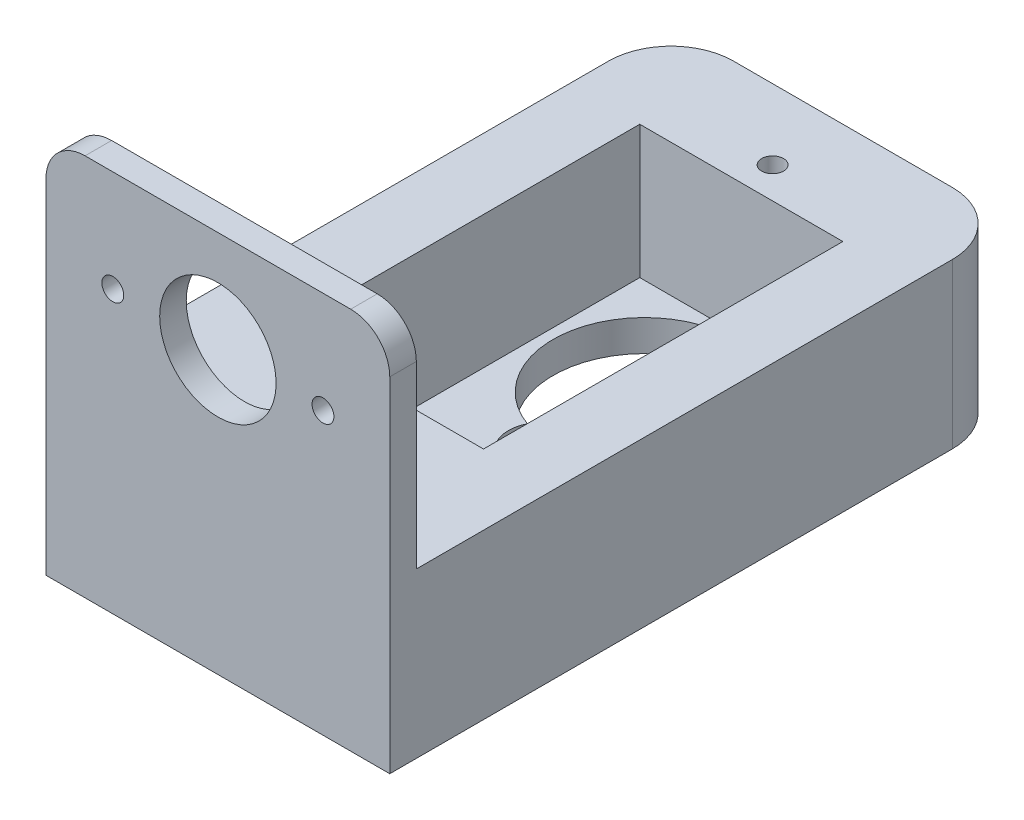
ISO-10303-21;
HEADER;
FILE_DESCRIPTION(('STEP AP214'),'2;1');
FILE_NAME('part.step','',(''),(''),'','','');
FILE_SCHEMA(('AUTOMOTIVE_DESIGN { 1 0 10303 214 1 1 1 1 }'));
ENDSEC;
DATA;
#1=APPLICATION_CONTEXT('core data for automotive mechanical design processes');
#2=APPLICATION_PROTOCOL_DEFINITION('international standard','automotive_design',2000,#1);
#3=PRODUCT_CONTEXT('',#1,'mechanical');
#4=PRODUCT('Part','Part','',(#3));
#5=PRODUCT_RELATED_PRODUCT_CATEGORY('part','',(#4));
#6=PRODUCT_DEFINITION_FORMATION('','',#4);
#7=PRODUCT_DEFINITION_CONTEXT('part definition',#1,'design');
#8=PRODUCT_DEFINITION('design','',#6,#7);
#9=PRODUCT_DEFINITION_SHAPE('','',#8);
#10=(LENGTH_UNIT() NAMED_UNIT(*) SI_UNIT(.MILLI.,.METRE.));
#11=(NAMED_UNIT(*) PLANE_ANGLE_UNIT() SI_UNIT($,.RADIAN.));
#12=(NAMED_UNIT(*) SI_UNIT($,.STERADIAN.) SOLID_ANGLE_UNIT());
#13=UNCERTAINTY_MEASURE_WITH_UNIT(LENGTH_MEASURE(1.E-05),#10,'distance_accuracy_value','');
#14=(GEOMETRIC_REPRESENTATION_CONTEXT(3) GLOBAL_UNCERTAINTY_ASSIGNED_CONTEXT((#13)) GLOBAL_UNIT_ASSIGNED_CONTEXT((#10,
#11,#12)) REPRESENTATION_CONTEXT('',''));
#15=CARTESIAN_POINT('',(0.,0.,0.));
#16=DIRECTION('',(0.,0.,1.));
#17=DIRECTION('',(1.,0.,0.));
#18=AXIS2_PLACEMENT_3D('',#15,#16,#17);
#19=CARTESIAN_POINT('',(0.,10.5,0.));
#20=DIRECTION('',(0.,0.,-1.));
#21=DIRECTION('',(-1.,0.,0.));
#22=AXIS2_PLACEMENT_3D('',#19,#20,#21);
#23=PLANE('',#22);
#24=CARTESIAN_POINT('',(4.275,18.,0.));
#25=DIRECTION('',(0.,0.,-1.));
#26=DIRECTION('',(-1.,0.,0.));
#27=AXIS2_PLACEMENT_3D('',#24,#25,#26);
#28=CIRCLE('',#27,0.7);
#29=CARTESIAN_POINT('',(3.575,18.,0.));
#30=VERTEX_POINT('',#29);
#31=EDGE_CURVE('E292',#30,#30,#28,.T.);
#32=ORIENTED_EDGE('',*,*,#31,.T.);
#33=EDGE_LOOP('',(#32));
#34=FACE_BOUND('',#33,.T.);
#35=CARTESIAN_POINT('',(17.725,18.,0.));
#36=DIRECTION('',(0.,0.,-1.));
#37=DIRECTION('',(-1.,0.,0.));
#38=AXIS2_PLACEMENT_3D('',#35,#36,#37);
#39=CIRCLE('',#38,0.699999999999998);
#40=CARTESIAN_POINT('',(17.025,18.,0.));
#41=VERTEX_POINT('',#40);
#42=EDGE_CURVE('E296',#41,#41,#39,.T.);
#43=ORIENTED_EDGE('',*,*,#42,.T.);
#44=EDGE_LOOP('',(#43));
#45=FACE_BOUND('',#44,.T.);
#46=CARTESIAN_POINT('',(11.,18.,0.));
#47=DIRECTION('',(0.,0.,-1.));
#48=DIRECTION('',(-1.,0.,0.));
#49=AXIS2_PLACEMENT_3D('',#46,#47,#48);
#50=CIRCLE('',#49,3.725);
#51=CARTESIAN_POINT('',(7.275,18.,0.));
#52=VERTEX_POINT('',#51);
#53=EDGE_CURVE('E284',#52,#52,#50,.T.);
#54=ORIENTED_EDGE('',*,*,#53,.T.);
#55=EDGE_LOOP('',(#54));
#56=FACE_BOUND('',#55,.T.);
#57=DIRECTION('',(1.,0.,0.));
#58=VECTOR('',#57,1.);
#59=CARTESIAN_POINT('',(0.,24.5,0.));
#60=LINE('',#59,#58);
#61=CARTESIAN_POINT('',(2.5,24.5,0.));
#62=VERTEX_POINT('',#61);
#63=CARTESIAN_POINT('',(19.5,24.5,0.));
#64=VERTEX_POINT('',#63);
#65=EDGE_CURVE('E273',#62,#64,#60,.T.);
#66=ORIENTED_EDGE('',*,*,#65,.F.);
#67=CARTESIAN_POINT('',(2.5,22.,0.));
#68=DIRECTION('',(0.,0.,-1.));
#69=DIRECTION('',(-1.,0.,0.));
#70=AXIS2_PLACEMENT_3D('',#67,#68,#69);
#71=CIRCLE('',#70,2.5);
#72=CARTESIAN_POINT('',(0.,22.,0.));
#73=VERTEX_POINT('',#72);
#74=EDGE_CURVE('E248',#62,#73,#71,.F.);
#75=ORIENTED_EDGE('',*,*,#74,.T.);
#76=DIRECTION('',(0.,-1.,0.));
#77=VECTOR('',#76,1.);
#78=CARTESIAN_POINT('',(0.,10.5,0.));
#79=LINE('',#78,#77);
#80=CARTESIAN_POINT('',(0.,0.,0.));
#81=VERTEX_POINT('',#80);
#82=EDGE_CURVE('E208',#73,#81,#79,.T.);
#83=ORIENTED_EDGE('',*,*,#82,.T.);
#84=DIRECTION('',(1.,0.,0.));
#85=VECTOR('',#84,1.);
#86=CARTESIAN_POINT('',(0.,0.,0.));
#87=LINE('',#86,#85);
#88=CARTESIAN_POINT('',(22.,0.,0.));
#89=VERTEX_POINT('',#88);
#90=EDGE_CURVE('E191',#81,#89,#87,.T.);
#91=ORIENTED_EDGE('',*,*,#90,.T.);
#92=DIRECTION('',(0.,-1.,0.));
#93=VECTOR('',#92,1.);
#94=CARTESIAN_POINT('',(22.,10.5,0.));
#95=LINE('',#94,#93);
#96=CARTESIAN_POINT('',(22.,22.,0.));
#97=VERTEX_POINT('',#96);
#98=EDGE_CURVE('E220',#97,#89,#95,.T.);
#99=ORIENTED_EDGE('',*,*,#98,.F.);
#100=CARTESIAN_POINT('',(19.5,22.,0.));
#101=DIRECTION('',(0.,0.,-1.));
#102=DIRECTION('',(-1.,0.,0.));
#103=AXIS2_PLACEMENT_3D('',#100,#101,#102);
#104=CIRCLE('',#103,2.5);
#105=EDGE_CURVE('E246',#97,#64,#104,.F.);
#106=ORIENTED_EDGE('',*,*,#105,.T.);
#107=EDGE_LOOP('',(#66,#75,#83,#91,#99,#106));
#108=FACE_BOUND('',#107,.T.);
#109=ADVANCED_FACE('F33',(#34,#45,#56,#108),#23,.F.);
#110=CARTESIAN_POINT('',(22.,10.5,0.));
#111=DIRECTION('',(-1.,0.,0.));
#112=DIRECTION('',(0.,0.,1.));
#113=AXIS2_PLACEMENT_3D('',#110,#111,#112);
#114=PLANE('',#113);
#115=DIRECTION('',(0.,-1.,0.));
#116=VECTOR('',#115,1.);
#117=CARTESIAN_POINT('',(22.,24.5,-1.7));
#118=LINE('',#117,#116);
#119=CARTESIAN_POINT('',(22.,22.,-1.7));
#120=VERTEX_POINT('',#119);
#121=CARTESIAN_POINT('',(22.,10.5,-1.7));
#122=VERTEX_POINT('',#121);
#123=EDGE_CURVE('E159',#120,#122,#118,.T.);
#124=ORIENTED_EDGE('',*,*,#123,.F.);
#125=DIRECTION('',(0.,0.,-1.));
#126=VECTOR('',#125,1.);
#127=CARTESIAN_POINT('',(22.,22.,0.));
#128=LINE('',#127,#126);
#129=EDGE_CURVE('E150',#120,#97,#128,.F.);
#130=ORIENTED_EDGE('',*,*,#129,.T.);
#131=ORIENTED_EDGE('',*,*,#98,.T.);
#132=DIRECTION('',(0.,0.,-1.));
#133=VECTOR('',#132,1.);
#134=CARTESIAN_POINT('',(22.,0.,0.));
#135=LINE('',#134,#133);
#136=CARTESIAN_POINT('',(22.,0.,-36.));
#137=VERTEX_POINT('',#136);
#138=EDGE_CURVE('E211',#89,#137,#135,.T.);
#139=ORIENTED_EDGE('',*,*,#138,.T.);
#140=DIRECTION('',(0.,-1.,0.));
#141=VECTOR('',#140,1.);
#142=CARTESIAN_POINT('',(22.,10.5,-36.));
#143=LINE('',#142,#141);
#144=CARTESIAN_POINT('',(22.,10.5,-36.));
#145=VERTEX_POINT('',#144);
#146=EDGE_CURVE('E238',#137,#145,#143,.F.);
#147=ORIENTED_EDGE('',*,*,#146,.T.);
#148=DIRECTION('',(0.,0.,-1.));
#149=VECTOR('',#148,1.);
#150=CARTESIAN_POINT('',(22.,10.5,0.));
#151=LINE('',#150,#149);
#152=EDGE_CURVE('E198',#122,#145,#151,.T.);
#153=ORIENTED_EDGE('',*,*,#152,.F.);
#154=EDGE_LOOP('',(#124,#130,#131,#139,#147,#153));
#155=FACE_BOUND('',#154,.T.);
#156=ADVANCED_FACE('F258',(#155),#114,.F.);
#157=CARTESIAN_POINT('',(0.,10.5,-40.));
#158=DIRECTION('',(0.,0.,-1.));
#159=DIRECTION('',(-1.,0.,0.));
#160=AXIS2_PLACEMENT_3D('',#157,#158,#159);
#161=PLANE('',#160);
#162=DIRECTION('',(1.,0.,0.));
#163=VECTOR('',#162,1.);
#164=CARTESIAN_POINT('',(0.,0.,-40.));
#165=LINE('',#164,#163);
#166=CARTESIAN_POINT('',(3.99999999999999,0.,-40.));
#167=VERTEX_POINT('',#166);
#168=CARTESIAN_POINT('',(18.,0.,-40.));
#169=VERTEX_POINT('',#168);
#170=EDGE_CURVE('E214',#167,#169,#165,.T.);
#171=ORIENTED_EDGE('',*,*,#170,.F.);
#172=DIRECTION('',(0.,-1.,0.));
#173=VECTOR('',#172,1.);
#174=CARTESIAN_POINT('',(3.99999999999999,10.5,-40.));
#175=LINE('',#174,#173);
#176=CARTESIAN_POINT('',(3.99999999999999,10.5,-40.));
#177=VERTEX_POINT('',#176);
#178=EDGE_CURVE('E232',#167,#177,#175,.F.);
#179=ORIENTED_EDGE('',*,*,#178,.T.);
#180=DIRECTION('',(1.,0.,0.));
#181=VECTOR('',#180,1.);
#182=CARTESIAN_POINT('',(0.,10.5,-40.));
#183=LINE('',#182,#181);
#184=CARTESIAN_POINT('',(18.,10.5,-40.));
#185=VERTEX_POINT('',#184);
#186=EDGE_CURVE('E201',#177,#185,#183,.T.);
#187=ORIENTED_EDGE('',*,*,#186,.T.);
#188=DIRECTION('',(0.,-1.,0.));
#189=VECTOR('',#188,1.);
#190=CARTESIAN_POINT('',(18.,0.,-40.));
#191=LINE('',#190,#189);
#192=EDGE_CURVE('E229',#185,#169,#191,.T.);
#193=ORIENTED_EDGE('',*,*,#192,.T.);
#194=EDGE_LOOP('',(#171,#179,#187,#193));
#195=FACE_BOUND('',#194,.T.);
#196=ADVANCED_FACE('F338',(#195),#161,.T.);
#197=CARTESIAN_POINT('',(0.,10.5,0.));
#198=DIRECTION('',(-1.,0.,0.));
#199=DIRECTION('',(0.,0.,1.));
#200=AXIS2_PLACEMENT_3D('',#197,#198,#199);
#201=PLANE('',#200);
#202=ORIENTED_EDGE('',*,*,#82,.F.);
#203=DIRECTION('',(0.,0.,1.));
#204=VECTOR('',#203,1.);
#205=CARTESIAN_POINT('',(0.,22.,0.));
#206=LINE('',#205,#204);
#207=CARTESIAN_POINT('',(0.,22.,-1.7));
#208=VERTEX_POINT('',#207);
#209=EDGE_CURVE('E250',#73,#208,#206,.F.);
#210=ORIENTED_EDGE('',*,*,#209,.T.);
#211=DIRECTION('',(0.,-1.,0.));
#212=VECTOR('',#211,1.);
#213=CARTESIAN_POINT('',(0.,24.5,-1.7));
#214=LINE('',#213,#212);
#215=CARTESIAN_POINT('',(0.,10.5,-1.7));
#216=VERTEX_POINT('',#215);
#217=EDGE_CURVE('E163',#208,#216,#214,.T.);
#218=ORIENTED_EDGE('',*,*,#217,.T.);
#219=DIRECTION('',(0.,0.,-1.));
#220=VECTOR('',#219,1.);
#221=CARTESIAN_POINT('',(0.,10.5,0.));
#222=LINE('',#221,#220);
#223=CARTESIAN_POINT('',(0.,10.5,-36.));
#224=VERTEX_POINT('',#223);
#225=EDGE_CURVE('E205',#216,#224,#222,.T.);
#226=ORIENTED_EDGE('',*,*,#225,.T.);
#227=DIRECTION('',(0.,-1.,0.));
#228=VECTOR('',#227,1.);
#229=CARTESIAN_POINT('',(0.,10.5,-36.));
#230=LINE('',#229,#228);
#231=CARTESIAN_POINT('',(0.,0.,-36.));
#232=VERTEX_POINT('',#231);
#233=EDGE_CURVE('E222',#224,#232,#230,.T.);
#234=ORIENTED_EDGE('',*,*,#233,.T.);
#235=DIRECTION('',(0.,0.,-1.));
#236=VECTOR('',#235,1.);
#237=CARTESIAN_POINT('',(0.,0.,0.));
#238=LINE('',#237,#236);
#239=EDGE_CURVE('E202',#81,#232,#238,.T.);
#240=ORIENTED_EDGE('',*,*,#239,.F.);
#241=EDGE_LOOP('',(#202,#210,#218,#226,#234,#240));
#242=FACE_BOUND('',#241,.T.);
#243=ADVANCED_FACE('F328',(#242),#201,.T.);
#244=CARTESIAN_POINT('',(0.,10.5,0.));
#245=DIRECTION('',(0.,1.,0.));
#246=DIRECTION('',(0.,0.,1.));
#247=AXIS2_PLACEMENT_3D('',#244,#245,#246);
#248=PLANE('',#247);
#249=CARTESIAN_POINT('',(11.,10.5,-35.5));
#250=DIRECTION('',(0.,1.,0.));
#251=DIRECTION('',(0.,0.,1.));
#252=AXIS2_PLACEMENT_3D('',#249,#250,#251);
#253=CIRCLE('',#252,0.699999999999999);
#254=CARTESIAN_POINT('',(11.,10.5,-34.8));
#255=VERTEX_POINT('',#254);
#256=EDGE_CURVE('E312',#255,#255,#253,.T.);
#257=ORIENTED_EDGE('',*,*,#256,.F.);
#258=EDGE_LOOP('',(#257));
#259=FACE_BOUND('',#258,.T.);
#260=CARTESIAN_POINT('',(11.,10.5,-7.5));
#261=DIRECTION('',(0.,1.,0.));
#262=DIRECTION('',(0.,0.,1.));
#263=AXIS2_PLACEMENT_3D('',#260,#261,#262);
#264=CIRCLE('',#263,0.7);
#265=CARTESIAN_POINT('',(11.,10.5,-6.8));
#266=VERTEX_POINT('',#265);
#267=EDGE_CURVE('E306',#266,#266,#264,.T.);
#268=ORIENTED_EDGE('',*,*,#267,.F.);
#269=EDGE_LOOP('',(#268));
#270=FACE_BOUND('',#269,.T.);
#271=ORIENTED_EDGE('',*,*,#186,.F.);
#272=CARTESIAN_POINT('',(3.99999999999999,10.5,-36.));
#273=DIRECTION('',(0.,1.,0.));
#274=DIRECTION('',(0.,0.,1.));
#275=AXIS2_PLACEMENT_3D('',#272,#273,#274);
#276=CIRCLE('',#275,4.);
#277=EDGE_CURVE('E236',#177,#224,#276,.T.);
#278=ORIENTED_EDGE('',*,*,#277,.T.);
#279=ORIENTED_EDGE('',*,*,#225,.F.);
#280=DIRECTION('',(-1.,0.,0.));
#281=VECTOR('',#280,1.);
#282=CARTESIAN_POINT('',(0.,10.5,-1.7));
#283=LINE('',#282,#281);
#284=EDGE_CURVE('E279',#122,#216,#283,.T.);
#285=ORIENTED_EDGE('',*,*,#284,.F.);
#286=ORIENTED_EDGE('',*,*,#152,.T.);
#287=CARTESIAN_POINT('',(18.,10.5,-36.));
#288=DIRECTION('',(0.,1.,0.));
#289=DIRECTION('',(0.,0.,1.));
#290=AXIS2_PLACEMENT_3D('',#287,#288,#289);
#291=CIRCLE('',#290,4.);
#292=EDGE_CURVE('E234',#145,#185,#291,.T.);
#293=ORIENTED_EDGE('',*,*,#292,.T.);
#294=EDGE_LOOP('',(#271,#278,#279,#285,#286,#293));
#295=FACE_BOUND('',#294,.T.);
#296=DIRECTION('',(0.,0.,1.));
#297=VECTOR('',#296,1.);
#298=CARTESIAN_POINT('',(4.5,10.5,-33.5));
#299=LINE('',#298,#297);
#300=CARTESIAN_POINT('',(4.5,10.5,-33.5));
#301=VERTEX_POINT('',#300);
#302=CARTESIAN_POINT('',(4.5,10.5,-10.5));
#303=VERTEX_POINT('',#302);
#304=EDGE_CURVE('E161',#301,#303,#299,.T.);
#305=ORIENTED_EDGE('',*,*,#304,.F.);
#306=DIRECTION('',(-1.,0.,0.));
#307=VECTOR('',#306,1.);
#308=CARTESIAN_POINT('',(4.5,10.5,-33.5));
#309=LINE('',#308,#307);
#310=CARTESIAN_POINT('',(17.5,10.5,-33.5));
#311=VERTEX_POINT('',#310);
#312=EDGE_CURVE('E170',#311,#301,#309,.T.);
#313=ORIENTED_EDGE('',*,*,#312,.F.);
#314=DIRECTION('',(0.,0.,-1.));
#315=VECTOR('',#314,1.);
#316=CARTESIAN_POINT('',(17.5,10.5,-33.5));
#317=LINE('',#316,#315);
#318=CARTESIAN_POINT('',(17.5,10.5,-10.5));
#319=VERTEX_POINT('',#318);
#320=EDGE_CURVE('E184',#319,#311,#317,.T.);
#321=ORIENTED_EDGE('',*,*,#320,.F.);
#322=DIRECTION('',(1.,0.,0.));
#323=VECTOR('',#322,1.);
#324=CARTESIAN_POINT('',(4.5,10.5,-10.5));
#325=LINE('',#324,#323);
#326=EDGE_CURVE('E181',#303,#319,#325,.T.);
#327=ORIENTED_EDGE('',*,*,#326,.F.);
#328=EDGE_LOOP('',(#305,#313,#321,#327));
#329=FACE_BOUND('',#328,.T.);
#330=ADVANCED_FACE('F322',(#259,#270,#295,#329),#248,.T.);
#331=CARTESIAN_POINT('',(0.,0.,0.));
#332=DIRECTION('',(0.,1.,0.));
#333=DIRECTION('',(0.,0.,1.));
#334=AXIS2_PLACEMENT_3D('',#331,#332,#333);
#335=PLANE('',#334);
#336=CARTESIAN_POINT('',(11.,0.,-27.3));
#337=DIRECTION('',(0.,1.,0.));
#338=DIRECTION('',(0.,0.,1.));
#339=AXIS2_PLACEMENT_3D('',#336,#337,#338);
#340=CIRCLE('',#339,5.85);
#341=CARTESIAN_POINT('',(12.8240947328389,0.,-21.7416568650695));
#342=VERTEX_POINT('',#341);
#343=CARTESIAN_POINT('',(9.00631329023559,0.,-21.8002078854462));
#344=VERTEX_POINT('',#343);
#345=EDGE_CURVE('E158',#342,#344,#340,.T.);
#346=ORIENTED_EDGE('',*,*,#345,.T.);
#347=CARTESIAN_POINT('',(10.9007535815422,0.,-20.828701426629));
#348=DIRECTION('',(0.,1.,0.));
#349=DIRECTION('',(0.,0.,1.));
#350=AXIS2_PLACEMENT_3D('',#347,#348,#349);
#351=CIRCLE('',#350,2.12902062386664);
#352=EDGE_CURVE('E48',#344,#342,#351,.T.);
#353=ORIENTED_EDGE('',*,*,#352,.T.);
#354=EDGE_LOOP('',(#346,#353));
#355=FACE_BOUND('',#354,.T.);
#356=ORIENTED_EDGE('',*,*,#239,.T.);
#357=CARTESIAN_POINT('',(3.99999999999999,0.,-36.));
#358=DIRECTION('',(0.,1.,0.));
#359=DIRECTION('',(0.,0.,1.));
#360=AXIS2_PLACEMENT_3D('',#357,#358,#359);
#361=CIRCLE('',#360,4.);
#362=EDGE_CURVE('E227',#232,#167,#361,.F.);
#363=ORIENTED_EDGE('',*,*,#362,.T.);
#364=ORIENTED_EDGE('',*,*,#170,.T.);
#365=CARTESIAN_POINT('',(18.,0.,-36.));
#366=DIRECTION('',(0.,1.,0.));
#367=DIRECTION('',(0.,0.,1.));
#368=AXIS2_PLACEMENT_3D('',#365,#366,#367);
#369=CIRCLE('',#368,4.);
#370=EDGE_CURVE('E225',#169,#137,#369,.F.);
#371=ORIENTED_EDGE('',*,*,#370,.T.);
#372=ORIENTED_EDGE('',*,*,#138,.F.);
#373=ORIENTED_EDGE('',*,*,#90,.F.);
#374=EDGE_LOOP('',(#356,#363,#364,#371,#372,#373));
#375=FACE_BOUND('',#374,.T.);
#376=ADVANCED_FACE('F318',(#355,#375),#335,.F.);
#377=CARTESIAN_POINT('',(4.5,2.,-33.5));
#378=DIRECTION('',(-1.,0.,0.));
#379=DIRECTION('',(0.,0.,1.));
#380=AXIS2_PLACEMENT_3D('',#377,#378,#379);
#381=PLANE('',#380);
#382=ORIENTED_EDGE('',*,*,#304,.T.);
#383=DIRECTION('',(0.,1.,0.));
#384=VECTOR('',#383,1.);
#385=CARTESIAN_POINT('',(4.5,2.,-10.5));
#386=LINE('',#385,#384);
#387=CARTESIAN_POINT('',(4.5,2.,-10.5));
#388=VERTEX_POINT('',#387);
#389=EDGE_CURVE('E179',#388,#303,#386,.T.);
#390=ORIENTED_EDGE('',*,*,#389,.F.);
#391=DIRECTION('',(0.,0.,1.));
#392=VECTOR('',#391,1.);
#393=CARTESIAN_POINT('',(4.5,2.,-33.5));
#394=LINE('',#393,#392);
#395=CARTESIAN_POINT('',(4.5,2.,-33.5));
#396=VERTEX_POINT('',#395);
#397=EDGE_CURVE('E166',#396,#388,#394,.T.);
#398=ORIENTED_EDGE('',*,*,#397,.F.);
#399=DIRECTION('',(0.,1.,0.));
#400=VECTOR('',#399,1.);
#401=CARTESIAN_POINT('',(4.5,2.,-33.5));
#402=LINE('',#401,#400);
#403=EDGE_CURVE('E189',#396,#301,#402,.T.);
#404=ORIENTED_EDGE('',*,*,#403,.T.);
#405=EDGE_LOOP('',(#382,#390,#398,#404));
#406=FACE_BOUND('',#405,.T.);
#407=ADVANCED_FACE('F321',(#406),#381,.F.);
#408=CARTESIAN_POINT('',(4.5,2.,-33.5));
#409=DIRECTION('',(0.,0.,-1.));
#410=DIRECTION('',(-1.,0.,0.));
#411=AXIS2_PLACEMENT_3D('',#408,#409,#410);
#412=PLANE('',#411);
#413=ORIENTED_EDGE('',*,*,#312,.T.);
#414=ORIENTED_EDGE('',*,*,#403,.F.);
#415=DIRECTION('',(-1.,0.,0.));
#416=VECTOR('',#415,1.);
#417=CARTESIAN_POINT('',(4.5,2.,-33.5));
#418=LINE('',#417,#416);
#419=CARTESIAN_POINT('',(17.5,2.,-33.5));
#420=VERTEX_POINT('',#419);
#421=EDGE_CURVE('E176',#420,#396,#418,.T.);
#422=ORIENTED_EDGE('',*,*,#421,.F.);
#423=DIRECTION('',(0.,1.,0.));
#424=VECTOR('',#423,1.);
#425=CARTESIAN_POINT('',(17.5,2.,-33.5));
#426=LINE('',#425,#424);
#427=EDGE_CURVE('E192',#420,#311,#426,.T.);
#428=ORIENTED_EDGE('',*,*,#427,.T.);
#429=EDGE_LOOP('',(#413,#414,#422,#428));
#430=FACE_BOUND('',#429,.T.);
#431=ADVANCED_FACE('F374',(#430),#412,.F.);
#432=CARTESIAN_POINT('',(17.5,2.,-33.5));
#433=DIRECTION('',(1.,0.,0.));
#434=DIRECTION('',(0.,0.,-1.));
#435=AXIS2_PLACEMENT_3D('',#432,#433,#434);
#436=PLANE('',#435);
#437=ORIENTED_EDGE('',*,*,#320,.T.);
#438=ORIENTED_EDGE('',*,*,#427,.F.);
#439=DIRECTION('',(0.,0.,-1.));
#440=VECTOR('',#439,1.);
#441=CARTESIAN_POINT('',(17.5,2.,-33.5));
#442=LINE('',#441,#440);
#443=CARTESIAN_POINT('',(17.5,2.,-10.5));
#444=VERTEX_POINT('',#443);
#445=EDGE_CURVE('E173',#444,#420,#442,.T.);
#446=ORIENTED_EDGE('',*,*,#445,.F.);
#447=DIRECTION('',(0.,1.,0.));
#448=VECTOR('',#447,1.);
#449=CARTESIAN_POINT('',(17.5,2.,-10.5));
#450=LINE('',#449,#448);
#451=EDGE_CURVE('E194',#444,#319,#450,.T.);
#452=ORIENTED_EDGE('',*,*,#451,.T.);
#453=EDGE_LOOP('',(#437,#438,#446,#452));
#454=FACE_BOUND('',#453,.T.);
#455=ADVANCED_FACE('F379',(#454),#436,.F.);
#456=CARTESIAN_POINT('',(4.5,2.,-10.5));
#457=DIRECTION('',(0.,0.,1.));
#458=DIRECTION('',(1.,0.,0.));
#459=AXIS2_PLACEMENT_3D('',#456,#457,#458);
#460=PLANE('',#459);
#461=ORIENTED_EDGE('',*,*,#326,.T.);
#462=ORIENTED_EDGE('',*,*,#451,.F.);
#463=DIRECTION('',(1.,0.,0.));
#464=VECTOR('',#463,1.);
#465=CARTESIAN_POINT('',(4.5,2.,-10.5));
#466=LINE('',#465,#464);
#467=EDGE_CURVE('E169',#388,#444,#466,.T.);
#468=ORIENTED_EDGE('',*,*,#467,.F.);
#469=ORIENTED_EDGE('',*,*,#389,.T.);
#470=EDGE_LOOP('',(#461,#462,#468,#469));
#471=FACE_BOUND('',#470,.T.);
#472=ADVANCED_FACE('F376',(#471),#460,.F.);
#473=CARTESIAN_POINT('',(0.,2.,0.));
#474=DIRECTION('',(0.,1.,0.));
#475=DIRECTION('',(0.,0.,1.));
#476=AXIS2_PLACEMENT_3D('',#473,#474,#475);
#477=PLANE('',#476);
#478=CARTESIAN_POINT('',(10.9007535815422,2.,-20.828701426629));
#479=DIRECTION('',(0.,1.,0.));
#480=DIRECTION('',(0.,0.,1.));
#481=AXIS2_PLACEMENT_3D('',#478,#479,#480);
#482=CIRCLE('',#481,2.12902062386664);
#483=CARTESIAN_POINT('',(9.0063132902356,2.,-21.8002078854462));
#484=VERTEX_POINT('',#483);
#485=CARTESIAN_POINT('',(12.8240947328389,2.,-21.7416568650695));
#486=VERTEX_POINT('',#485);
#487=EDGE_CURVE('E145',#484,#486,#482,.T.);
#488=ORIENTED_EDGE('',*,*,#487,.F.);
#489=CARTESIAN_POINT('',(11.,2.,-27.3));
#490=DIRECTION('',(0.,1.,0.));
#491=DIRECTION('',(0.,0.,1.));
#492=AXIS2_PLACEMENT_3D('',#489,#490,#491);
#493=CIRCLE('',#492,5.85);
#494=EDGE_CURVE('E155',#486,#484,#493,.T.);
#495=ORIENTED_EDGE('',*,*,#494,.F.);
#496=EDGE_LOOP('',(#488,#495));
#497=FACE_BOUND('',#496,.T.);
#498=ORIENTED_EDGE('',*,*,#397,.T.);
#499=ORIENTED_EDGE('',*,*,#467,.T.);
#500=ORIENTED_EDGE('',*,*,#445,.T.);
#501=ORIENTED_EDGE('',*,*,#421,.T.);
#502=EDGE_LOOP('',(#498,#499,#500,#501));
#503=FACE_BOUND('',#502,.T.);
#504=ADVANCED_FACE('F153',(#497,#503),#477,.T.);
#505=CARTESIAN_POINT('',(11.,0.,-27.3));
#506=DIRECTION('',(0.,1.,0.));
#507=DIRECTION('',(0.,0.,1.));
#508=AXIS2_PLACEMENT_3D('',#505,#506,#507);
#509=CYLINDRICAL_SURFACE('',#508,5.85);
#510=ORIENTED_EDGE('',*,*,#345,.F.);
#511=DIRECTION('',(0.,1.,0.));
#512=VECTOR('',#511,1.);
#513=CARTESIAN_POINT('',(12.8240947328389,-3.,-21.7416568650695));
#514=LINE('',#513,#512);
#515=EDGE_CURVE('E11',#342,#486,#514,.T.);
#516=ORIENTED_EDGE('',*,*,#515,.T.);
#517=ORIENTED_EDGE('',*,*,#494,.T.);
#518=DIRECTION('',(0.,1.,0.));
#519=VECTOR('',#518,1.);
#520=CARTESIAN_POINT('',(9.0063132902356,-3.,-21.8002078854462));
#521=LINE('',#520,#519);
#522=EDGE_CURVE('E41',#484,#344,#521,.F.);
#523=ORIENTED_EDGE('',*,*,#522,.T.);
#524=EDGE_LOOP('',(#510,#516,#517,#523));
#525=FACE_BOUND('',#524,.T.);
#526=ADVANCED_FACE('F157',(#525),#509,.F.);
#527=CARTESIAN_POINT('',(0.,24.5,-1.7));
#528=DIRECTION('',(0.,0.,1.));
#529=DIRECTION('',(1.,0.,0.));
#530=AXIS2_PLACEMENT_3D('',#527,#528,#529);
#531=PLANE('',#530);
#532=CARTESIAN_POINT('',(4.275,18.,-1.7));
#533=DIRECTION('',(0.,0.,-1.));
#534=DIRECTION('',(-1.,0.,0.));
#535=AXIS2_PLACEMENT_3D('',#532,#533,#534);
#536=CIRCLE('',#535,0.7);
#537=CARTESIAN_POINT('',(3.575,18.,-1.7));
#538=VERTEX_POINT('',#537);
#539=EDGE_CURVE('E300',#538,#538,#536,.T.);
#540=ORIENTED_EDGE('',*,*,#539,.F.);
#541=EDGE_LOOP('',(#540));
#542=FACE_BOUND('',#541,.T.);
#543=CARTESIAN_POINT('',(17.725,18.,-1.7));
#544=DIRECTION('',(0.,0.,-1.));
#545=DIRECTION('',(-1.,0.,0.));
#546=AXIS2_PLACEMENT_3D('',#543,#544,#545);
#547=CIRCLE('',#546,0.699999999999998);
#548=CARTESIAN_POINT('',(17.025,18.,-1.7));
#549=VERTEX_POINT('',#548);
#550=EDGE_CURVE('E299',#549,#549,#547,.T.);
#551=ORIENTED_EDGE('',*,*,#550,.F.);
#552=EDGE_LOOP('',(#551));
#553=FACE_BOUND('',#552,.T.);
#554=CARTESIAN_POINT('',(11.,18.,-1.7));
#555=DIRECTION('',(0.,0.,-1.));
#556=DIRECTION('',(-1.,0.,0.));
#557=AXIS2_PLACEMENT_3D('',#554,#555,#556);
#558=CIRCLE('',#557,3.725);
#559=CARTESIAN_POINT('',(7.275,18.,-1.7));
#560=VERTEX_POINT('',#559);
#561=EDGE_CURVE('E287',#560,#560,#558,.T.);
#562=ORIENTED_EDGE('',*,*,#561,.F.);
#563=EDGE_LOOP('',(#562));
#564=FACE_BOUND('',#563,.T.);
#565=ORIENTED_EDGE('',*,*,#217,.F.);
#566=CARTESIAN_POINT('',(2.5,22.,-1.7));
#567=DIRECTION('',(0.,0.,1.));
#568=DIRECTION('',(1.,0.,0.));
#569=AXIS2_PLACEMENT_3D('',#566,#567,#568);
#570=CIRCLE('',#569,2.5);
#571=CARTESIAN_POINT('',(2.5,24.5,-1.7));
#572=VERTEX_POINT('',#571);
#573=EDGE_CURVE('E253',#208,#572,#570,.F.);
#574=ORIENTED_EDGE('',*,*,#573,.T.);
#575=DIRECTION('',(-1.,0.,0.));
#576=VECTOR('',#575,1.);
#577=CARTESIAN_POINT('',(0.,24.5,-1.7));
#578=LINE('',#577,#576);
#579=CARTESIAN_POINT('',(19.5,24.5,-1.7));
#580=VERTEX_POINT('',#579);
#581=EDGE_CURVE('E271',#580,#572,#578,.T.);
#582=ORIENTED_EDGE('',*,*,#581,.F.);
#583=CARTESIAN_POINT('',(19.5,22.,-1.7));
#584=DIRECTION('',(0.,0.,1.));
#585=DIRECTION('',(1.,0.,0.));
#586=AXIS2_PLACEMENT_3D('',#583,#584,#585);
#587=CIRCLE('',#586,2.5);
#588=EDGE_CURVE('E56',#580,#120,#587,.F.);
#589=ORIENTED_EDGE('',*,*,#588,.T.);
#590=ORIENTED_EDGE('',*,*,#123,.T.);
#591=ORIENTED_EDGE('',*,*,#284,.T.);
#592=EDGE_LOOP('',(#565,#574,#582,#589,#590,#591));
#593=FACE_BOUND('',#592,.T.);
#594=ADVANCED_FACE('F275',(#542,#553,#564,#593),#531,.F.);
#595=CARTESIAN_POINT('',(0.,24.5,0.));
#596=DIRECTION('',(0.,1.,0.));
#597=DIRECTION('',(0.,0.,1.));
#598=AXIS2_PLACEMENT_3D('',#595,#596,#597);
#599=PLANE('',#598);
#600=ORIENTED_EDGE('',*,*,#581,.T.);
#601=DIRECTION('',(0.,0.,1.));
#602=VECTOR('',#601,1.);
#603=CARTESIAN_POINT('',(2.5,24.5,0.));
#604=LINE('',#603,#602);
#605=EDGE_CURVE('E243',#572,#62,#604,.T.);
#606=ORIENTED_EDGE('',*,*,#605,.T.);
#607=ORIENTED_EDGE('',*,*,#65,.T.);
#608=DIRECTION('',(0.,0.,-1.));
#609=VECTOR('',#608,1.);
#610=CARTESIAN_POINT('',(19.5,24.5,-1.7));
#611=LINE('',#610,#609);
#612=EDGE_CURVE('E240',#64,#580,#611,.T.);
#613=ORIENTED_EDGE('',*,*,#612,.T.);
#614=EDGE_LOOP('',(#600,#606,#607,#613));
#615=FACE_BOUND('',#614,.T.);
#616=ADVANCED_FACE('F270',(#615),#599,.T.);
#617=CARTESIAN_POINT('',(11.,18.,0.));
#618=DIRECTION('',(0.,0.,-1.));
#619=DIRECTION('',(-1.,0.,0.));
#620=AXIS2_PLACEMENT_3D('',#617,#618,#619);
#621=CYLINDRICAL_SURFACE('',#620,3.725);
#622=ORIENTED_EDGE('',*,*,#53,.F.);
#623=EDGE_LOOP('',(#622));
#624=FACE_BOUND('',#623,.T.);
#625=ORIENTED_EDGE('',*,*,#561,.T.);
#626=EDGE_LOOP('',(#625));
#627=FACE_BOUND('',#626,.T.);
#628=ADVANCED_FACE('F396',(#624,#627),#621,.F.);
#629=CARTESIAN_POINT('',(17.725,18.,8.3));
#630=DIRECTION('',(0.,0.,-1.));
#631=DIRECTION('',(-1.,0.,0.));
#632=AXIS2_PLACEMENT_3D('',#629,#630,#631);
#633=CYLINDRICAL_SURFACE('',#632,0.699999999999998);
#634=ORIENTED_EDGE('',*,*,#550,.T.);
#635=EDGE_LOOP('',(#634));
#636=FACE_BOUND('',#635,.T.);
#637=ORIENTED_EDGE('',*,*,#42,.F.);
#638=EDGE_LOOP('',(#637));
#639=FACE_BOUND('',#638,.T.);
#640=ADVANCED_FACE('F399',(#636,#639),#633,.F.);
#641=CARTESIAN_POINT('',(4.275,18.,8.3));
#642=DIRECTION('',(0.,0.,-1.));
#643=DIRECTION('',(-1.,0.,0.));
#644=AXIS2_PLACEMENT_3D('',#641,#642,#643);
#645=CYLINDRICAL_SURFACE('',#644,0.7);
#646=ORIENTED_EDGE('',*,*,#539,.T.);
#647=EDGE_LOOP('',(#646));
#648=FACE_BOUND('',#647,.T.);
#649=ORIENTED_EDGE('',*,*,#31,.F.);
#650=EDGE_LOOP('',(#649));
#651=FACE_BOUND('',#650,.T.);
#652=ADVANCED_FACE('F401',(#648,#651),#645,.F.);
#653=CARTESIAN_POINT('',(11.,8.,-7.5));
#654=DIRECTION('',(0.,1.,0.));
#655=DIRECTION('',(0.,0.,1.));
#656=AXIS2_PLACEMENT_3D('',#653,#654,#655);
#657=CYLINDRICAL_SURFACE('',#656,0.7);
#658=CARTESIAN_POINT('',(11.,8.,-7.5));
#659=DIRECTION('',(0.,1.,0.));
#660=DIRECTION('',(0.,0.,1.));
#661=AXIS2_PLACEMENT_3D('',#658,#659,#660);
#662=CIRCLE('',#661,0.7);
#663=CARTESIAN_POINT('',(11.,8.,-6.8));
#664=VERTEX_POINT('',#663);
#665=EDGE_CURVE('E309',#664,#664,#662,.T.);
#666=ORIENTED_EDGE('',*,*,#665,.F.);
#667=EDGE_LOOP('',(#666));
#668=FACE_BOUND('',#667,.T.);
#669=ORIENTED_EDGE('',*,*,#267,.T.);
#670=EDGE_LOOP('',(#669));
#671=FACE_BOUND('',#670,.T.);
#672=ADVANCED_FACE('F404',(#668,#671),#657,.F.);
#673=CARTESIAN_POINT('',(11.,8.,-7.5));
#674=DIRECTION('',(0.,1.,0.));
#675=DIRECTION('',(0.,0.,1.));
#676=AXIS2_PLACEMENT_3D('',#673,#674,#675);
#677=PLANE('',#676);
#678=ORIENTED_EDGE('',*,*,#665,.T.);
#679=EDGE_LOOP('',(#678));
#680=FACE_BOUND('',#679,.T.);
#681=ADVANCED_FACE('F411',(#680),#677,.T.);
#682=CARTESIAN_POINT('',(11.,8.,-35.5));
#683=DIRECTION('',(0.,1.,0.));
#684=DIRECTION('',(0.,0.,1.));
#685=AXIS2_PLACEMENT_3D('',#682,#683,#684);
#686=CYLINDRICAL_SURFACE('',#685,0.699999999999999);
#687=CARTESIAN_POINT('',(11.,8.,-35.5));
#688=DIRECTION('',(0.,1.,0.));
#689=DIRECTION('',(0.,0.,1.));
#690=AXIS2_PLACEMENT_3D('',#687,#688,#689);
#691=CIRCLE('',#690,0.699999999999999);
#692=CARTESIAN_POINT('',(11.,8.,-34.8));
#693=VERTEX_POINT('',#692);
#694=EDGE_CURVE('E303',#693,#693,#691,.T.);
#695=ORIENTED_EDGE('',*,*,#694,.F.);
#696=EDGE_LOOP('',(#695));
#697=FACE_BOUND('',#696,.T.);
#698=ORIENTED_EDGE('',*,*,#256,.T.);
#699=EDGE_LOOP('',(#698));
#700=FACE_BOUND('',#699,.T.);
#701=ADVANCED_FACE('F415',(#697,#700),#686,.F.);
#702=CARTESIAN_POINT('',(11.,8.,-35.5));
#703=DIRECTION('',(0.,1.,0.));
#704=DIRECTION('',(0.,0.,1.));
#705=AXIS2_PLACEMENT_3D('',#702,#703,#704);
#706=PLANE('',#705);
#707=ORIENTED_EDGE('',*,*,#694,.T.);
#708=EDGE_LOOP('',(#707));
#709=FACE_BOUND('',#708,.T.);
#710=ADVANCED_FACE('F354',(#709),#706,.T.);
#711=CARTESIAN_POINT('',(3.99999999999999,10.5,-36.));
#712=DIRECTION('',(0.,-1.,0.));
#713=DIRECTION('',(0.,0.,-1.));
#714=AXIS2_PLACEMENT_3D('',#711,#712,#713);
#715=CYLINDRICAL_SURFACE('',#714,4.);
#716=ORIENTED_EDGE('',*,*,#277,.F.);
#717=ORIENTED_EDGE('',*,*,#178,.F.);
#718=ORIENTED_EDGE('',*,*,#362,.F.);
#719=ORIENTED_EDGE('',*,*,#233,.F.);
#720=EDGE_LOOP('',(#716,#717,#718,#719));
#721=FACE_BOUND('',#720,.T.);
#722=ADVANCED_FACE('F334',(#721),#715,.T.);
#723=CARTESIAN_POINT('',(18.,10.5,-36.));
#724=DIRECTION('',(0.,1.,0.));
#725=DIRECTION('',(0.,0.,1.));
#726=AXIS2_PLACEMENT_3D('',#723,#724,#725);
#727=CYLINDRICAL_SURFACE('',#726,4.);
#728=ORIENTED_EDGE('',*,*,#292,.F.);
#729=ORIENTED_EDGE('',*,*,#146,.F.);
#730=ORIENTED_EDGE('',*,*,#370,.F.);
#731=ORIENTED_EDGE('',*,*,#192,.F.);
#732=EDGE_LOOP('',(#728,#729,#730,#731));
#733=FACE_BOUND('',#732,.T.);
#734=ADVANCED_FACE('F345',(#733),#727,.T.);
#735=CARTESIAN_POINT('',(2.5,22.,0.));
#736=DIRECTION('',(0.,0.,1.));
#737=DIRECTION('',(1.,0.,0.));
#738=AXIS2_PLACEMENT_3D('',#735,#736,#737);
#739=CYLINDRICAL_SURFACE('',#738,2.5);
#740=ORIENTED_EDGE('',*,*,#573,.F.);
#741=ORIENTED_EDGE('',*,*,#209,.F.);
#742=ORIENTED_EDGE('',*,*,#74,.F.);
#743=ORIENTED_EDGE('',*,*,#605,.F.);
#744=EDGE_LOOP('',(#740,#741,#742,#743));
#745=FACE_BOUND('',#744,.T.);
#746=ADVANCED_FACE('F347',(#745),#739,.T.);
#747=CARTESIAN_POINT('',(19.5,22.,0.));
#748=DIRECTION('',(0.,0.,1.));
#749=DIRECTION('',(1.,0.,0.));
#750=AXIS2_PLACEMENT_3D('',#747,#748,#749);
#751=CYLINDRICAL_SURFACE('',#750,2.5);
#752=ORIENTED_EDGE('',*,*,#105,.F.);
#753=ORIENTED_EDGE('',*,*,#129,.F.);
#754=ORIENTED_EDGE('',*,*,#588,.F.);
#755=ORIENTED_EDGE('',*,*,#612,.F.);
#756=EDGE_LOOP('',(#752,#753,#754,#755));
#757=FACE_BOUND('',#756,.T.);
#758=ADVANCED_FACE('F35',(#757),#751,.T.);
#759=CARTESIAN_POINT('',(10.9007535815422,-8.,-20.828701426629));
#760=DIRECTION('',(0.,1.,0.));
#761=DIRECTION('',(0.,0.,1.));
#762=AXIS2_PLACEMENT_3D('',#759,#760,#761);
#763=CYLINDRICAL_SURFACE('',#762,2.12902062386664);
#764=ORIENTED_EDGE('',*,*,#352,.F.);
#765=ORIENTED_EDGE('',*,*,#522,.F.);
#766=ORIENTED_EDGE('',*,*,#487,.T.);
#767=ORIENTED_EDGE('',*,*,#515,.F.);
#768=EDGE_LOOP('',(#764,#765,#766,#767));
#769=FACE_BOUND('',#768,.T.);
#770=ADVANCED_FACE('F144',(#769),#763,.F.);
#771=CLOSED_SHELL('',(#109,#156,#196,#243,#330,#376,#407,#431,#455,#472,#504,#526,#594,#616,
#628,#640,#652,#672,#681,#701,#710,#722,#734,#746,#758,#770));
#772=MANIFOLD_SOLID_BREP('B2',#771);
#773=ADVANCED_BREP_SHAPE_REPRESENTATION('',(#18,#772),#14);
#774=SHAPE_DEFINITION_REPRESENTATION(#9,#773);
ENDSEC;
END-ISO-10303-21;
